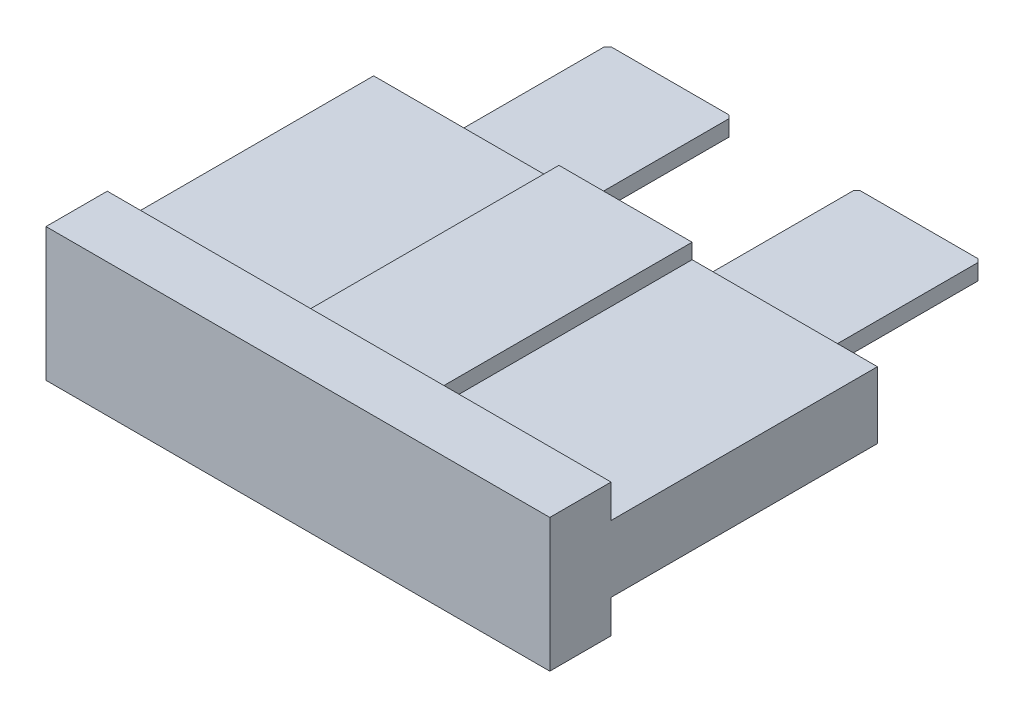
ISO-10303-21;
HEADER;
FILE_DESCRIPTION(('STEP AP214'),'2;1');
FILE_NAME('part.step','',(''),(''),'','','');
FILE_SCHEMA(('AUTOMOTIVE_DESIGN { 1 0 10303 214 1 1 1 1 }'));
ENDSEC;
DATA;
#1=APPLICATION_CONTEXT('core data for automotive mechanical design processes');
#2=APPLICATION_PROTOCOL_DEFINITION('international standard','automotive_design',2000,#1);
#3=PRODUCT_CONTEXT('',#1,'mechanical');
#4=PRODUCT('Part','Part','',(#3));
#5=PRODUCT_RELATED_PRODUCT_CATEGORY('part','',(#4));
#6=PRODUCT_DEFINITION_FORMATION('','',#4);
#7=PRODUCT_DEFINITION_CONTEXT('part definition',#1,'design');
#8=PRODUCT_DEFINITION('design','',#6,#7);
#9=PRODUCT_DEFINITION_SHAPE('','',#8);
#10=(LENGTH_UNIT() NAMED_UNIT(*) SI_UNIT(.MILLI.,.METRE.));
#11=(NAMED_UNIT(*) PLANE_ANGLE_UNIT() SI_UNIT($,.RADIAN.));
#12=(NAMED_UNIT(*) SI_UNIT($,.STERADIAN.) SOLID_ANGLE_UNIT());
#13=UNCERTAINTY_MEASURE_WITH_UNIT(LENGTH_MEASURE(1.E-05),#10,'distance_accuracy_value','');
#14=(GEOMETRIC_REPRESENTATION_CONTEXT(3) GLOBAL_UNCERTAINTY_ASSIGNED_CONTEXT((#13)) GLOBAL_UNIT_ASSIGNED_CONTEXT((#10,
#11,#12)) REPRESENTATION_CONTEXT('',''));
#15=CARTESIAN_POINT('',(0.,0.,0.));
#16=DIRECTION('',(0.,0.,1.));
#17=DIRECTION('',(1.,0.,0.));
#18=AXIS2_PLACEMENT_3D('',#15,#16,#17);
#19=CARTESIAN_POINT('',(-52.0016807572496,11.3994658131918,-16.7386));
#20=DIRECTION('',(0.,0.,1.));
#21=DIRECTION('',(1.,0.,0.));
#22=AXIS2_PLACEMENT_3D('',#19,#20,#21);
#23=PLANE('',#22);
#24=DIRECTION('',(0.,1.,0.));
#25=VECTOR('',#24,1.);
#26=CARTESIAN_POINT('',(-54.1225807572496,11.3994658131918,-16.7386));
#27=LINE('',#26,#25);
#28=CARTESIAN_POINT('',(-54.1225807572496,11.5772658131918,-16.7386));
#29=VERTEX_POINT('',#28);
#30=CARTESIAN_POINT('',(-54.1225807572496,11.2216658131918,-16.7386));
#31=VERTEX_POINT('',#30);
#32=EDGE_CURVE('E225',#29,#31,#27,.F.);
#33=ORIENTED_EDGE('',*,*,#32,.F.);
#34=DIRECTION('',(1.,0.,0.));
#35=VECTOR('',#34,1.);
#36=CARTESIAN_POINT('',(-50.8142307572496,11.5772658131918,-16.7386));
#37=LINE('',#36,#35);
#38=CARTESIAN_POINT('',(-49.8807807572496,11.5772658131918,-16.7386));
#39=VERTEX_POINT('',#38);
#40=EDGE_CURVE('E242',#39,#29,#37,.F.);
#41=ORIENTED_EDGE('',*,*,#40,.F.);
#42=DIRECTION('',(0.,1.,0.));
#43=VECTOR('',#42,1.);
#44=CARTESIAN_POINT('',(-49.8807807572496,11.3994658131918,-16.7386));
#45=LINE('',#44,#43);
#46=CARTESIAN_POINT('',(-49.8807807572496,11.2216658131918,-16.7386));
#47=VERTEX_POINT('',#46);
#48=EDGE_CURVE('E20',#47,#39,#45,.T.);
#49=ORIENTED_EDGE('',*,*,#48,.F.);
#50=DIRECTION('',(1.,0.,0.));
#51=VECTOR('',#50,1.);
#52=CARTESIAN_POINT('',(-53.1891307572496,11.2216658131918,-16.7386));
#53=LINE('',#52,#51);
#54=EDGE_CURVE('E239',#31,#47,#53,.T.);
#55=ORIENTED_EDGE('',*,*,#54,.F.);
#56=EDGE_LOOP('',(#33,#41,#49,#55));
#57=FACE_BOUND('',#56,.T.);
#58=ADVANCED_FACE('F17',(#57),#23,.F.);
#59=CARTESIAN_POINT('',(-61.5016807572496,11.3994658131918,-16.7386));
#60=DIRECTION('',(0.,0.,1.));
#61=DIRECTION('',(1.,0.,0.));
#62=AXIS2_PLACEMENT_3D('',#59,#60,#61);
#63=PLANE('',#62);
#64=DIRECTION('',(0.,1.,0.));
#65=VECTOR('',#64,1.);
#66=CARTESIAN_POINT('',(-59.3807807572496,11.3994658131918,-16.7386));
#67=LINE('',#66,#65);
#68=CARTESIAN_POINT('',(-59.3807807572496,11.2216658131918,-16.7386));
#69=VERTEX_POINT('',#68);
#70=CARTESIAN_POINT('',(-59.3807807572496,11.5772658131918,-16.7386));
#71=VERTEX_POINT('',#70);
#72=EDGE_CURVE('E243',#69,#71,#67,.T.);
#73=ORIENTED_EDGE('',*,*,#72,.F.);
#74=DIRECTION('',(1.,0.,0.));
#75=VECTOR('',#74,1.);
#76=CARTESIAN_POINT('',(-62.6891307572496,11.2216658131918,-16.7386));
#77=LINE('',#76,#75);
#78=CARTESIAN_POINT('',(-63.6225807572496,11.2216658131918,-16.7386));
#79=VERTEX_POINT('',#78);
#80=EDGE_CURVE('E270',#79,#69,#77,.T.);
#81=ORIENTED_EDGE('',*,*,#80,.F.);
#82=DIRECTION('',(0.,1.,0.));
#83=VECTOR('',#82,1.);
#84=CARTESIAN_POINT('',(-63.6225807572496,11.3994658131918,-16.7386));
#85=LINE('',#84,#83);
#86=CARTESIAN_POINT('',(-63.6225807572496,11.5772658131918,-16.7386));
#87=VERTEX_POINT('',#86);
#88=EDGE_CURVE('E237',#87,#79,#85,.F.);
#89=ORIENTED_EDGE('',*,*,#88,.F.);
#90=DIRECTION('',(1.,0.,0.));
#91=VECTOR('',#90,1.);
#92=CARTESIAN_POINT('',(-60.3142307572496,11.5772658131918,-16.7386));
#93=LINE('',#92,#91);
#94=EDGE_CURVE('E274',#71,#87,#93,.F.);
#95=ORIENTED_EDGE('',*,*,#94,.F.);
#96=EDGE_LOOP('',(#73,#81,#89,#95));
#97=FACE_BOUND('',#96,.T.);
#98=ADVANCED_FACE('F271',(#97),#63,.F.);
#99=CARTESIAN_POINT('',(-53.1891307572496,11.1581658131918,-16.6751));
#100=DIRECTION('',(0.,-0.707106781186548,-0.707106781186548));
#101=DIRECTION('',(0.,0.707106781186548,-0.707106781186548));
#102=AXIS2_PLACEMENT_3D('',#99,#100,#101);
#103=PLANE('',#102);
#104=DIRECTION('',(-0.577350269189631,-0.577350269189615,0.577350269189631));
#105=VECTOR('',#104,1.);
#106=CARTESIAN_POINT('',(-54.1225807572496,11.2216658131918,-16.7386));
#107=LINE('',#106,#105);
#108=CARTESIAN_POINT('',(-54.2495807572496,11.0946658131918,-16.6116));
#109=VERTEX_POINT('',#108);
#110=EDGE_CURVE('E233',#31,#109,#107,.T.);
#111=ORIENTED_EDGE('',*,*,#110,.F.);
#112=ORIENTED_EDGE('',*,*,#54,.T.);
#113=DIRECTION('',(-0.577350269189631,0.577350269189615,-0.577350269189631));
#114=VECTOR('',#113,1.);
#115=CARTESIAN_POINT('',(-49.7537807572496,11.0946658131918,-16.6116));
#116=LINE('',#115,#114);
#117=CARTESIAN_POINT('',(-49.7537807572496,11.0946658131918,-16.6116));
#118=VERTEX_POINT('',#117);
#119=EDGE_CURVE('E292',#118,#47,#116,.T.);
#120=ORIENTED_EDGE('',*,*,#119,.F.);
#121=DIRECTION('',(1.,0.,0.));
#122=VECTOR('',#121,1.);
#123=CARTESIAN_POINT('',(-54.3765807572496,11.0946658131918,-16.6116));
#124=LINE('',#123,#122);
#125=EDGE_CURVE('E247',#109,#118,#124,.T.);
#126=ORIENTED_EDGE('',*,*,#125,.F.);
#127=EDGE_LOOP('',(#111,#112,#120,#126));
#128=FACE_BOUND('',#127,.T.);
#129=ADVANCED_FACE('F245',(#128),#103,.T.);
#130=CARTESIAN_POINT('',(-50.8142307572496,11.6407658131918,-16.6751));
#131=DIRECTION('',(0.,0.707106781186548,-0.707106781186548));
#132=DIRECTION('',(0.,0.707106781186548,0.707106781186548));
#133=AXIS2_PLACEMENT_3D('',#130,#131,#132);
#134=PLANE('',#133);
#135=DIRECTION('',(0.577350269189628,0.577350269189621,0.577350269189628));
#136=VECTOR('',#135,1.);
#137=CARTESIAN_POINT('',(-49.8807807572496,11.5772658131918,-16.7386));
#138=LINE('',#137,#136);
#139=CARTESIAN_POINT('',(-49.7537807572496,11.7042658131918,-16.6116));
#140=VERTEX_POINT('',#139);
#141=EDGE_CURVE('E289',#39,#140,#138,.T.);
#142=ORIENTED_EDGE('',*,*,#141,.F.);
#143=ORIENTED_EDGE('',*,*,#40,.T.);
#144=DIRECTION('',(0.577350269189628,-0.577350269189621,-0.577350269189628));
#145=VECTOR('',#144,1.);
#146=CARTESIAN_POINT('',(-54.2495807572496,11.7042658131918,-16.6116));
#147=LINE('',#146,#145);
#148=CARTESIAN_POINT('',(-54.2495807572496,11.7042658131918,-16.6116));
#149=VERTEX_POINT('',#148);
#150=EDGE_CURVE('E236',#149,#29,#147,.T.);
#151=ORIENTED_EDGE('',*,*,#150,.F.);
#152=DIRECTION('',(1.,0.,0.));
#153=VECTOR('',#152,1.);
#154=CARTESIAN_POINT('',(-49.6267807572496,11.7042658131918,-16.6116));
#155=LINE('',#154,#153);
#156=EDGE_CURVE('E309',#140,#149,#155,.F.);
#157=ORIENTED_EDGE('',*,*,#156,.F.);
#158=EDGE_LOOP('',(#142,#143,#151,#157));
#159=FACE_BOUND('',#158,.T.);
#160=ADVANCED_FACE('F458',(#159),#134,.T.);
#161=CARTESIAN_POINT('',(-54.2495807572496,11.5518658131918,-16.6116));
#162=DIRECTION('',(-0.707106781186544,0.,-0.707106781186551));
#163=DIRECTION('',(-0.707106781186551,0.,0.707106781186544));
#164=AXIS2_PLACEMENT_3D('',#161,#162,#163);
#165=PLANE('',#164);
#166=ORIENTED_EDGE('',*,*,#150,.T.);
#167=ORIENTED_EDGE('',*,*,#32,.T.);
#168=ORIENTED_EDGE('',*,*,#110,.T.);
#169=DIRECTION('',(0.707106781186528,0.,-0.707106781186567));
#170=VECTOR('',#169,1.);
#171=CARTESIAN_POINT('',(-54.3765807572496,11.0946658131918,-16.4846));
#172=LINE('',#171,#170);
#173=CARTESIAN_POINT('',(-54.3765807572496,11.0946658131918,-16.4846));
#174=VERTEX_POINT('',#173);
#175=EDGE_CURVE('E307',#174,#109,#172,.T.);
#176=ORIENTED_EDGE('',*,*,#175,.F.);
#177=DIRECTION('',(0.,1.,0.));
#178=VECTOR('',#177,1.);
#179=CARTESIAN_POINT('',(-54.3765807572496,11.7042658131918,-16.4846));
#180=LINE('',#179,#178);
#181=CARTESIAN_POINT('',(-54.3765807572496,11.7042658131918,-16.4846));
#182=VERTEX_POINT('',#181);
#183=EDGE_CURVE('E249',#182,#174,#180,.F.);
#184=ORIENTED_EDGE('',*,*,#183,.F.);
#185=DIRECTION('',(-0.707106781186547,0.,0.707106781186547));
#186=VECTOR('',#185,1.);
#187=CARTESIAN_POINT('',(-54.2495807572496,11.7042658131918,-16.6116));
#188=LINE('',#187,#186);
#189=EDGE_CURVE('E451',#149,#182,#188,.T.);
#190=ORIENTED_EDGE('',*,*,#189,.F.);
#191=EDGE_LOOP('',(#166,#167,#168,#176,#184,#190));
#192=FACE_BOUND('',#191,.T.);
#193=ADVANCED_FACE('F230',(#192),#165,.T.);
#194=CARTESIAN_POINT('',(-54.3765807572496,11.7042658131918,-10.16));
#195=DIRECTION('',(-1.,0.,0.));
#196=DIRECTION('',(0.,0.,1.));
#197=AXIS2_PLACEMENT_3D('',#194,#195,#196);
#198=PLANE('',#197);
#199=DIRECTION('',(0.,1.,0.));
#200=VECTOR('',#199,1.);
#201=CARTESIAN_POINT('',(-54.3765807572496,11.7042658131918,-10.16));
#202=LINE('',#201,#200);
#203=CARTESIAN_POINT('',(-54.3765807572496,11.0946658131918,-10.16));
#204=VERTEX_POINT('',#203);
#205=CARTESIAN_POINT('',(-54.3765807572496,11.7042658131918,-10.16));
#206=VERTEX_POINT('',#205);
#207=EDGE_CURVE('E296',#204,#206,#202,.T.);
#208=ORIENTED_EDGE('',*,*,#207,.T.);
#209=DIRECTION('',(0.,0.,1.));
#210=VECTOR('',#209,1.);
#211=CARTESIAN_POINT('',(-54.3765807572496,11.7042658131918,-10.16));
#212=LINE('',#211,#210);
#213=EDGE_CURVE('E305',#182,#206,#212,.T.);
#214=ORIENTED_EDGE('',*,*,#213,.F.);
#215=ORIENTED_EDGE('',*,*,#183,.T.);
#216=DIRECTION('',(0.,0.,-1.));
#217=VECTOR('',#216,1.);
#218=CARTESIAN_POINT('',(-54.3765807572496,11.0946658131918,-10.16));
#219=LINE('',#218,#217);
#220=EDGE_CURVE('E302',#204,#174,#219,.T.);
#221=ORIENTED_EDGE('',*,*,#220,.F.);
#222=EDGE_LOOP('',(#208,#214,#215,#221));
#223=FACE_BOUND('',#222,.T.);
#224=ADVANCED_FACE('F300',(#223),#198,.T.);
#225=CARTESIAN_POINT('',(-49.6267807572496,11.0946658131918,-10.16));
#226=DIRECTION('',(1.,0.,0.));
#227=DIRECTION('',(0.,0.,-1.));
#228=AXIS2_PLACEMENT_3D('',#225,#226,#227);
#229=PLANE('',#228);
#230=DIRECTION('',(0.,1.,0.));
#231=VECTOR('',#230,1.);
#232=CARTESIAN_POINT('',(-49.6267807572496,11.0946658131918,-10.16));
#233=LINE('',#232,#231);
#234=CARTESIAN_POINT('',(-49.6267807572496,11.7042658131918,-10.16));
#235=VERTEX_POINT('',#234);
#236=CARTESIAN_POINT('',(-49.6267807572496,11.0946658131918,-10.16));
#237=VERTEX_POINT('',#236);
#238=EDGE_CURVE('E294',#235,#237,#233,.F.);
#239=ORIENTED_EDGE('',*,*,#238,.T.);
#240=DIRECTION('',(0.,0.,-1.));
#241=VECTOR('',#240,1.);
#242=CARTESIAN_POINT('',(-49.6267807572496,11.0946658131918,-10.16));
#243=LINE('',#242,#241);
#244=CARTESIAN_POINT('',(-49.6267807572496,11.0946658131918,-16.4846));
#245=VERTEX_POINT('',#244);
#246=EDGE_CURVE('E315',#245,#237,#243,.F.);
#247=ORIENTED_EDGE('',*,*,#246,.F.);
#248=DIRECTION('',(0.,1.,0.));
#249=VECTOR('',#248,1.);
#250=CARTESIAN_POINT('',(-49.6267807572496,11.2470658131918,-16.4846));
#251=LINE('',#250,#249);
#252=CARTESIAN_POINT('',(-49.6267807572496,11.7042658131918,-16.4846));
#253=VERTEX_POINT('',#252);
#254=EDGE_CURVE('E275',#253,#245,#251,.F.);
#255=ORIENTED_EDGE('',*,*,#254,.F.);
#256=DIRECTION('',(0.,0.,1.));
#257=VECTOR('',#256,1.);
#258=CARTESIAN_POINT('',(-49.6267807572496,11.7042658131918,-10.16));
#259=LINE('',#258,#257);
#260=EDGE_CURVE('E447',#235,#253,#259,.F.);
#261=ORIENTED_EDGE('',*,*,#260,.F.);
#262=EDGE_LOOP('',(#239,#247,#255,#261));
#263=FACE_BOUND('',#262,.T.);
#264=ADVANCED_FACE('F467',(#263),#229,.T.);
#265=CARTESIAN_POINT('',(-49.7537807572496,11.2470658131918,-16.6116));
#266=DIRECTION('',(0.707106781186544,0.,-0.707106781186551));
#267=DIRECTION('',(-0.707106781186551,0.,-0.707106781186544));
#268=AXIS2_PLACEMENT_3D('',#265,#266,#267);
#269=PLANE('',#268);
#270=ORIENTED_EDGE('',*,*,#254,.T.);
#271=DIRECTION('',(0.707106781186547,0.,0.707106781186547));
#272=VECTOR('',#271,1.);
#273=CARTESIAN_POINT('',(-49.7537807572496,11.0946658131918,-16.6116));
#274=LINE('',#273,#272);
#275=EDGE_CURVE('E317',#118,#245,#274,.T.);
#276=ORIENTED_EDGE('',*,*,#275,.F.);
#277=ORIENTED_EDGE('',*,*,#119,.T.);
#278=ORIENTED_EDGE('',*,*,#48,.T.);
#279=ORIENTED_EDGE('',*,*,#141,.T.);
#280=DIRECTION('',(-0.707106781186547,0.,-0.707106781186547));
#281=VECTOR('',#280,1.);
#282=CARTESIAN_POINT('',(-49.6267807572496,11.7042658131918,-16.4846));
#283=LINE('',#282,#281);
#284=EDGE_CURVE('E444',#253,#140,#283,.T.);
#285=ORIENTED_EDGE('',*,*,#284,.F.);
#286=EDGE_LOOP('',(#270,#276,#277,#278,#279,#285));
#287=FACE_BOUND('',#286,.T.);
#288=ADVANCED_FACE('F460',(#287),#269,.T.);
#289=CARTESIAN_POINT('',(-62.6891307572496,11.1581658131918,-16.6751));
#290=DIRECTION('',(0.,-0.707106781186548,-0.707106781186548));
#291=DIRECTION('',(0.,0.707106781186548,-0.707106781186548));
#292=AXIS2_PLACEMENT_3D('',#289,#290,#291);
#293=PLANE('',#292);
#294=DIRECTION('',(-0.577350269189663,-0.577350269189584,0.577350269189631));
#295=VECTOR('',#294,1.);
#296=CARTESIAN_POINT('',(-63.6225807572496,11.2216658131918,-16.7386));
#297=LINE('',#296,#295);
#298=CARTESIAN_POINT('',(-63.7495807572496,11.0946658131918,-16.6116));
#299=VERTEX_POINT('',#298);
#300=EDGE_CURVE('E262',#79,#299,#297,.T.);
#301=ORIENTED_EDGE('',*,*,#300,.F.);
#302=ORIENTED_EDGE('',*,*,#80,.T.);
#303=DIRECTION('',(-0.577350269189621,0.577350269189636,-0.577350269189621));
#304=VECTOR('',#303,1.);
#305=CARTESIAN_POINT('',(-59.2537807572496,11.0946658131918,-16.6116));
#306=LINE('',#305,#304);
#307=CARTESIAN_POINT('',(-59.2537807572496,11.0946658131918,-16.6116));
#308=VERTEX_POINT('',#307);
#309=EDGE_CURVE('E339',#308,#69,#306,.T.);
#310=ORIENTED_EDGE('',*,*,#309,.F.);
#311=DIRECTION('',(1.,0.,0.));
#312=VECTOR('',#311,1.);
#313=CARTESIAN_POINT('',(-63.8765807572496,11.0946658131918,-16.6116));
#314=LINE('',#313,#312);
#315=EDGE_CURVE('E279',#299,#308,#314,.T.);
#316=ORIENTED_EDGE('',*,*,#315,.F.);
#317=EDGE_LOOP('',(#301,#302,#310,#316));
#318=FACE_BOUND('',#317,.T.);
#319=ADVANCED_FACE('F277',(#318),#293,.T.);
#320=CARTESIAN_POINT('',(-60.3142307572496,11.6407658131918,-16.6751));
#321=DIRECTION('',(0.,0.707106781186548,-0.707106781186548));
#322=DIRECTION('',(0.,0.707106781186548,0.707106781186548));
#323=AXIS2_PLACEMENT_3D('',#320,#321,#322);
#324=PLANE('',#323);
#325=DIRECTION('',(0.577350269189613,0.577350269189636,0.577350269189628));
#326=VECTOR('',#325,1.);
#327=CARTESIAN_POINT('',(-59.3807807572496,11.5772658131918,-16.7386));
#328=LINE('',#327,#326);
#329=CARTESIAN_POINT('',(-59.2537807572496,11.7042658131918,-16.6116));
#330=VERTEX_POINT('',#329);
#331=EDGE_CURVE('E343',#71,#330,#328,.T.);
#332=ORIENTED_EDGE('',*,*,#331,.F.);
#333=ORIENTED_EDGE('',*,*,#94,.T.);
#334=DIRECTION('',(0.57735026918966,-0.577350269189589,-0.577350269189628));
#335=VECTOR('',#334,1.);
#336=CARTESIAN_POINT('',(-63.7495807572496,11.7042658131918,-16.6116));
#337=LINE('',#336,#335);
#338=CARTESIAN_POINT('',(-63.7495807572496,11.7042658131918,-16.6116));
#339=VERTEX_POINT('',#338);
#340=EDGE_CURVE('E265',#339,#87,#337,.T.);
#341=ORIENTED_EDGE('',*,*,#340,.F.);
#342=DIRECTION('',(1.,0.,0.));
#343=VECTOR('',#342,1.);
#344=CARTESIAN_POINT('',(-59.1267807572496,11.7042658131918,-16.6116));
#345=LINE('',#344,#343);
#346=EDGE_CURVE('E432',#330,#339,#345,.F.);
#347=ORIENTED_EDGE('',*,*,#346,.F.);
#348=EDGE_LOOP('',(#332,#333,#341,#347));
#349=FACE_BOUND('',#348,.T.);
#350=ADVANCED_FACE('F572',(#349),#324,.T.);
#351=CARTESIAN_POINT('',(-63.7495807572496,11.5518658131918,-16.6116));
#352=DIRECTION('',(-0.707106781186532,0.,-0.707106781186563));
#353=DIRECTION('',(-0.707106781186563,0.,0.707106781186532));
#354=AXIS2_PLACEMENT_3D('',#351,#352,#353);
#355=PLANE('',#354);
#356=DIRECTION('',(0.,1.,0.));
#357=VECTOR('',#356,1.);
#358=CARTESIAN_POINT('',(-63.8765807572496,11.7042658131918,-16.4846));
#359=LINE('',#358,#357);
#360=CARTESIAN_POINT('',(-63.8765807572496,11.7042658131918,-16.4846));
#361=VERTEX_POINT('',#360);
#362=CARTESIAN_POINT('',(-63.8765807572496,11.0946658131918,-16.4846));
#363=VERTEX_POINT('',#362);
#364=EDGE_CURVE('E280',#361,#363,#359,.F.);
#365=ORIENTED_EDGE('',*,*,#364,.F.);
#366=DIRECTION('',(-0.707106781186547,0.,0.707106781186547));
#367=VECTOR('',#366,1.);
#368=CARTESIAN_POINT('',(-63.7495807572496,11.7042658131918,-16.6116));
#369=LINE('',#368,#367);
#370=EDGE_CURVE('E366',#339,#361,#369,.T.);
#371=ORIENTED_EDGE('',*,*,#370,.F.);
#372=ORIENTED_EDGE('',*,*,#340,.T.);
#373=ORIENTED_EDGE('',*,*,#88,.T.);
#374=ORIENTED_EDGE('',*,*,#300,.T.);
#375=DIRECTION('',(0.707106781186509,0.,-0.707106781186586));
#376=VECTOR('',#375,1.);
#377=CARTESIAN_POINT('',(-63.8765807572496,11.0946658131918,-16.4846));
#378=LINE('',#377,#376);
#379=EDGE_CURVE('E434',#363,#299,#378,.T.);
#380=ORIENTED_EDGE('',*,*,#379,.F.);
#381=EDGE_LOOP('',(#365,#371,#372,#373,#374,#380));
#382=FACE_BOUND('',#381,.T.);
#383=ADVANCED_FACE('F259',(#382),#355,.T.);
#384=CARTESIAN_POINT('',(-63.8765807572496,11.7042658131918,-10.16));
#385=DIRECTION('',(-1.,0.,0.));
#386=DIRECTION('',(0.,0.,1.));
#387=AXIS2_PLACEMENT_3D('',#384,#385,#386);
#388=PLANE('',#387);
#389=DIRECTION('',(0.,1.,0.));
#390=VECTOR('',#389,1.);
#391=CARTESIAN_POINT('',(-63.8765807572496,11.7042658131918,-10.16));
#392=LINE('',#391,#390);
#393=CARTESIAN_POINT('',(-63.8765807572496,11.0946658131918,-10.16));
#394=VERTEX_POINT('',#393);
#395=CARTESIAN_POINT('',(-63.8765807572496,11.7042658131918,-10.16));
#396=VERTEX_POINT('',#395);
#397=EDGE_CURVE('E282',#394,#396,#392,.T.);
#398=ORIENTED_EDGE('',*,*,#397,.T.);
#399=DIRECTION('',(0.,0.,1.));
#400=VECTOR('',#399,1.);
#401=CARTESIAN_POINT('',(-63.8765807572496,11.7042658131918,-10.16));
#402=LINE('',#401,#400);
#403=EDGE_CURVE('E352',#361,#396,#402,.T.);
#404=ORIENTED_EDGE('',*,*,#403,.F.);
#405=ORIENTED_EDGE('',*,*,#364,.T.);
#406=DIRECTION('',(0.,0.,-1.));
#407=VECTOR('',#406,1.);
#408=CARTESIAN_POINT('',(-63.8765807572496,11.0946658131918,-10.16));
#409=LINE('',#408,#407);
#410=EDGE_CURVE('E355',#394,#363,#409,.T.);
#411=ORIENTED_EDGE('',*,*,#410,.F.);
#412=EDGE_LOOP('',(#398,#404,#405,#411));
#413=FACE_BOUND('',#412,.T.);
#414=ADVANCED_FACE('F351',(#413),#388,.T.);
#415=CARTESIAN_POINT('',(-59.1267807572496,11.0946658131918,-10.16));
#416=DIRECTION('',(1.,0.,0.));
#417=DIRECTION('',(0.,0.,-1.));
#418=AXIS2_PLACEMENT_3D('',#415,#416,#417);
#419=PLANE('',#418);
#420=DIRECTION('',(0.,1.,0.));
#421=VECTOR('',#420,1.);
#422=CARTESIAN_POINT('',(-59.1267807572496,11.0946658131918,-10.16));
#423=LINE('',#422,#421);
#424=CARTESIAN_POINT('',(-59.1267807572496,11.7042658131918,-10.16));
#425=VERTEX_POINT('',#424);
#426=CARTESIAN_POINT('',(-59.1267807572496,11.0946658131918,-10.16));
#427=VERTEX_POINT('',#426);
#428=EDGE_CURVE('E346',#425,#427,#423,.F.);
#429=ORIENTED_EDGE('',*,*,#428,.T.);
#430=DIRECTION('',(0.,0.,-1.));
#431=VECTOR('',#430,1.);
#432=CARTESIAN_POINT('',(-59.1267807572496,11.0946658131918,-10.16));
#433=LINE('',#432,#431);
#434=CARTESIAN_POINT('',(-59.1267807572496,11.0946658131918,-16.4846));
#435=VERTEX_POINT('',#434);
#436=EDGE_CURVE('E437',#435,#427,#433,.F.);
#437=ORIENTED_EDGE('',*,*,#436,.F.);
#438=DIRECTION('',(0.,1.,0.));
#439=VECTOR('',#438,1.);
#440=CARTESIAN_POINT('',(-59.1267807572496,11.2470658131918,-16.4846));
#441=LINE('',#440,#439);
#442=CARTESIAN_POINT('',(-59.1267807572496,11.7042658131918,-16.4846));
#443=VERTEX_POINT('',#442);
#444=EDGE_CURVE('E341',#443,#435,#441,.F.);
#445=ORIENTED_EDGE('',*,*,#444,.F.);
#446=DIRECTION('',(0.,0.,1.));
#447=VECTOR('',#446,1.);
#448=CARTESIAN_POINT('',(-59.1267807572496,11.7042658131918,-10.16));
#449=LINE('',#448,#447);
#450=EDGE_CURVE('E367',#425,#443,#449,.F.);
#451=ORIENTED_EDGE('',*,*,#450,.F.);
#452=EDGE_LOOP('',(#429,#437,#445,#451));
#453=FACE_BOUND('',#452,.T.);
#454=ADVANCED_FACE('F563',(#453),#419,.T.);
#455=CARTESIAN_POINT('',(-59.2537807572496,11.2470658131918,-16.6116));
#456=DIRECTION('',(0.707106781186557,0.,-0.707106781186538));
#457=DIRECTION('',(-0.707106781186538,0.,-0.707106781186557));
#458=AXIS2_PLACEMENT_3D('',#455,#456,#457);
#459=PLANE('',#458);
#460=ORIENTED_EDGE('',*,*,#309,.T.);
#461=ORIENTED_EDGE('',*,*,#72,.T.);
#462=ORIENTED_EDGE('',*,*,#331,.T.);
#463=DIRECTION('',(-0.707106781186528,0.,-0.707106781186567));
#464=VECTOR('',#463,1.);
#465=CARTESIAN_POINT('',(-59.1267807572496,11.7042658131918,-16.4846));
#466=LINE('',#465,#464);
#467=EDGE_CURVE('E427',#443,#330,#466,.T.);
#468=ORIENTED_EDGE('',*,*,#467,.F.);
#469=ORIENTED_EDGE('',*,*,#444,.T.);
#470=DIRECTION('',(0.707106781186528,0.,0.707106781186567));
#471=VECTOR('',#470,1.);
#472=CARTESIAN_POINT('',(-59.2537807572496,11.0946658131918,-16.6116));
#473=LINE('',#472,#471);
#474=EDGE_CURVE('E440',#308,#435,#473,.T.);
#475=ORIENTED_EDGE('',*,*,#474,.F.);
#476=EDGE_LOOP('',(#460,#461,#462,#468,#469,#475));
#477=FACE_BOUND('',#476,.T.);
#478=ADVANCED_FACE('F559',(#477),#459,.T.);
#479=CARTESIAN_POINT('',(-54.2055307572496,11.3994658131918,-5.08));
#480=DIRECTION('',(-1.,0.,0.));
#481=DIRECTION('',(0.,0.,1.));
#482=AXIS2_PLACEMENT_3D('',#479,#480,#481);
#483=PLANE('',#482);
#484=DIRECTION('',(0.,1.,0.));
#485=VECTOR('',#484,1.);
#486=CARTESIAN_POINT('',(-54.2055307572496,11.3994658131918,-10.16));
#487=LINE('',#486,#485);
#488=CARTESIAN_POINT('',(-54.2055307572496,13.2473158131918,-10.16));
#489=VERTEX_POINT('',#488);
#490=CARTESIAN_POINT('',(-54.2055307572496,12.6694658131918,-10.16));
#491=VERTEX_POINT('',#490);
#492=EDGE_CURVE('E335',#489,#491,#487,.F.);
#493=ORIENTED_EDGE('',*,*,#492,.F.);
#494=DIRECTION('',(0.,0.,-1.));
#495=VECTOR('',#494,1.);
#496=CARTESIAN_POINT('',(-54.2055307572496,13.2473158131918,-5.08));
#497=LINE('',#496,#495);
#498=CARTESIAN_POINT('',(-54.2055307572496,13.2473158131918,0.));
#499=VERTEX_POINT('',#498);
#500=EDGE_CURVE('E324',#489,#499,#497,.F.);
#501=ORIENTED_EDGE('',*,*,#500,.T.);
#502=DIRECTION('',(0.,1.,0.));
#503=VECTOR('',#502,1.);
#504=CARTESIAN_POINT('',(-54.2055307572496,11.3994658131918,0.));
#505=LINE('',#504,#503);
#506=CARTESIAN_POINT('',(-54.2055307572496,12.6694658131918,0.));
#507=VERTEX_POINT('',#506);
#508=EDGE_CURVE('E337',#507,#499,#505,.T.);
#509=ORIENTED_EDGE('',*,*,#508,.F.);
#510=DIRECTION('',(0.,0.,-1.));
#511=VECTOR('',#510,1.);
#512=CARTESIAN_POINT('',(-54.2055307572496,12.6694658131918,-5.08));
#513=LINE('',#512,#511);
#514=EDGE_CURVE('E416',#507,#491,#513,.T.);
#515=ORIENTED_EDGE('',*,*,#514,.T.);
#516=EDGE_LOOP('',(#493,#501,#509,#515));
#517=FACE_BOUND('',#516,.T.);
#518=ADVANCED_FACE('F555',(#517),#483,.F.);
#519=CARTESIAN_POINT('',(-54.2055307572496,11.3994658131918,-5.08));
#520=DIRECTION('',(-1.,0.,0.));
#521=DIRECTION('',(0.,0.,1.));
#522=AXIS2_PLACEMENT_3D('',#519,#520,#521);
#523=PLANE('',#522);
#524=DIRECTION('',(0.,1.,0.));
#525=VECTOR('',#524,1.);
#526=CARTESIAN_POINT('',(-54.2055307572496,11.3994658131918,0.));
#527=LINE('',#526,#525);
#528=CARTESIAN_POINT('',(-54.2055307572496,9.55161581319177,0.));
#529=VERTEX_POINT('',#528);
#530=CARTESIAN_POINT('',(-54.2055307572496,10.1294658131918,0.));
#531=VERTEX_POINT('',#530);
#532=EDGE_CURVE('E331',#529,#531,#527,.T.);
#533=ORIENTED_EDGE('',*,*,#532,.F.);
#534=DIRECTION('',(0.,0.,1.));
#535=VECTOR('',#534,1.);
#536=CARTESIAN_POINT('',(-54.2055307572496,9.55161581319177,-5.08));
#537=LINE('',#536,#535);
#538=CARTESIAN_POINT('',(-54.2055307572496,9.55161581319177,-10.16));
#539=VERTEX_POINT('',#538);
#540=EDGE_CURVE('E422',#529,#539,#537,.F.);
#541=ORIENTED_EDGE('',*,*,#540,.T.);
#542=DIRECTION('',(0.,1.,0.));
#543=VECTOR('',#542,1.);
#544=CARTESIAN_POINT('',(-54.2055307572496,11.3994658131918,-10.16));
#545=LINE('',#544,#543);
#546=CARTESIAN_POINT('',(-54.2055307572496,10.1294658131918,-10.16));
#547=VERTEX_POINT('',#546);
#548=EDGE_CURVE('E333',#547,#539,#545,.F.);
#549=ORIENTED_EDGE('',*,*,#548,.F.);
#550=DIRECTION('',(0.,0.,1.));
#551=VECTOR('',#550,1.);
#552=CARTESIAN_POINT('',(-54.2055307572496,10.1294658131918,-5.08));
#553=LINE('',#552,#551);
#554=EDGE_CURVE('E413',#547,#531,#553,.T.);
#555=ORIENTED_EDGE('',*,*,#554,.T.);
#556=EDGE_LOOP('',(#533,#541,#549,#555));
#557=FACE_BOUND('',#556,.T.);
#558=ADVANCED_FACE('F551',(#557),#523,.F.);
#559=CARTESIAN_POINT('',(-59.2855307572496,11.3994658131918,-5.08));
#560=DIRECTION('',(1.,0.,0.));
#561=DIRECTION('',(0.,0.,-1.));
#562=AXIS2_PLACEMENT_3D('',#559,#560,#561);
#563=PLANE('',#562);
#564=DIRECTION('',(0.,1.,0.));
#565=VECTOR('',#564,1.);
#566=CARTESIAN_POINT('',(-59.2855307572496,11.3994658131918,-10.16));
#567=LINE('',#566,#565);
#568=CARTESIAN_POINT('',(-59.2855307572496,9.55161581319177,-10.16));
#569=VERTEX_POINT('',#568);
#570=CARTESIAN_POINT('',(-59.2855307572496,10.1294658131918,-10.16));
#571=VERTEX_POINT('',#570);
#572=EDGE_CURVE('E327',#569,#571,#567,.T.);
#573=ORIENTED_EDGE('',*,*,#572,.F.);
#574=DIRECTION('',(0.,0.,1.));
#575=VECTOR('',#574,1.);
#576=CARTESIAN_POINT('',(-59.2855307572496,9.55161581319177,-5.08));
#577=LINE('',#576,#575);
#578=CARTESIAN_POINT('',(-59.2855307572496,9.55161581319177,0.));
#579=VERTEX_POINT('',#578);
#580=EDGE_CURVE('E419',#569,#579,#577,.T.);
#581=ORIENTED_EDGE('',*,*,#580,.T.);
#582=DIRECTION('',(0.,1.,0.));
#583=VECTOR('',#582,1.);
#584=CARTESIAN_POINT('',(-59.2855307572496,11.3994658131918,0.));
#585=LINE('',#584,#583);
#586=CARTESIAN_POINT('',(-59.2855307572496,10.1294658131918,0.));
#587=VERTEX_POINT('',#586);
#588=EDGE_CURVE('E329',#587,#579,#585,.F.);
#589=ORIENTED_EDGE('',*,*,#588,.F.);
#590=DIRECTION('',(0.,0.,1.));
#591=VECTOR('',#590,1.);
#592=CARTESIAN_POINT('',(-59.2855307572496,10.1294658131918,-5.08));
#593=LINE('',#592,#591);
#594=EDGE_CURVE('E400',#587,#571,#593,.F.);
#595=ORIENTED_EDGE('',*,*,#594,.T.);
#596=EDGE_LOOP('',(#573,#581,#589,#595));
#597=FACE_BOUND('',#596,.T.);
#598=ADVANCED_FACE('F547',(#597),#563,.F.);
#599=CARTESIAN_POINT('',(-56.7455307572496,13.2473158131918,-5.08));
#600=DIRECTION('',(0.,-1.,0.));
#601=DIRECTION('',(0.,0.,-1.));
#602=AXIS2_PLACEMENT_3D('',#599,#600,#601);
#603=PLANE('',#602);
#604=DIRECTION('',(1.,0.,0.));
#605=VECTOR('',#604,1.);
#606=CARTESIAN_POINT('',(-56.7455307572496,13.2473158131918,-10.16));
#607=LINE('',#606,#605);
#608=CARTESIAN_POINT('',(-59.2855307572496,13.2473158131918,-10.16));
#609=VERTEX_POINT('',#608);
#610=EDGE_CURVE('E398',#489,#609,#607,.F.);
#611=ORIENTED_EDGE('',*,*,#610,.T.);
#612=DIRECTION('',(0.,0.,-1.));
#613=VECTOR('',#612,1.);
#614=CARTESIAN_POINT('',(-59.2855307572496,13.2473158131918,-5.08));
#615=LINE('',#614,#613);
#616=CARTESIAN_POINT('',(-59.2855307572496,13.2473158131918,0.));
#617=VERTEX_POINT('',#616);
#618=EDGE_CURVE('E425',#609,#617,#615,.F.);
#619=ORIENTED_EDGE('',*,*,#618,.T.);
#620=DIRECTION('',(1.,0.,0.));
#621=VECTOR('',#620,1.);
#622=CARTESIAN_POINT('',(-56.7455307572496,13.2473158131918,0.));
#623=LINE('',#622,#621);
#624=EDGE_CURVE('E403',#617,#499,#623,.T.);
#625=ORIENTED_EDGE('',*,*,#624,.T.);
#626=ORIENTED_EDGE('',*,*,#500,.F.);
#627=EDGE_LOOP('',(#611,#619,#625,#626));
#628=FACE_BOUND('',#627,.T.);
#629=ADVANCED_FACE('F544',(#628),#603,.F.);
#630=CARTESIAN_POINT('',(-54.3765807572496,11.0946658131918,-10.16));
#631=DIRECTION('',(0.,-1.,0.));
#632=DIRECTION('',(0.,0.,-1.));
#633=AXIS2_PLACEMENT_3D('',#630,#631,#632);
#634=PLANE('',#633);
#635=ORIENTED_EDGE('',*,*,#220,.T.);
#636=ORIENTED_EDGE('',*,*,#175,.T.);
#637=ORIENTED_EDGE('',*,*,#125,.T.);
#638=ORIENTED_EDGE('',*,*,#275,.T.);
#639=ORIENTED_EDGE('',*,*,#246,.T.);
#640=DIRECTION('',(1.,0.,0.));
#641=VECTOR('',#640,1.);
#642=CARTESIAN_POINT('',(-56.7455307572496,11.0946658131918,-10.16));
#643=LINE('',#642,#641);
#644=EDGE_CURVE('E314',#237,#204,#643,.F.);
#645=ORIENTED_EDGE('',*,*,#644,.T.);
#646=EDGE_LOOP('',(#635,#636,#637,#638,#639,#645));
#647=FACE_BOUND('',#646,.T.);
#648=ADVANCED_FACE('F311',(#647),#634,.T.);
#649=CARTESIAN_POINT('',(-49.6267807572496,11.7042658131918,-10.16));
#650=DIRECTION('',(0.,1.,0.));
#651=DIRECTION('',(0.,0.,1.));
#652=AXIS2_PLACEMENT_3D('',#649,#650,#651);
#653=PLANE('',#652);
#654=ORIENTED_EDGE('',*,*,#260,.T.);
#655=ORIENTED_EDGE('',*,*,#284,.T.);
#656=ORIENTED_EDGE('',*,*,#156,.T.);
#657=ORIENTED_EDGE('',*,*,#189,.T.);
#658=ORIENTED_EDGE('',*,*,#213,.T.);
#659=DIRECTION('',(1.,0.,0.));
#660=VECTOR('',#659,1.);
#661=CARTESIAN_POINT('',(-56.7455307572496,11.7042658131918,-10.16));
#662=LINE('',#661,#660);
#663=EDGE_CURVE('E378',#206,#235,#662,.T.);
#664=ORIENTED_EDGE('',*,*,#663,.T.);
#665=EDGE_LOOP('',(#654,#655,#656,#657,#658,#664));
#666=FACE_BOUND('',#665,.T.);
#667=ADVANCED_FACE('F454',(#666),#653,.T.);
#668=CARTESIAN_POINT('',(-63.8765807572496,11.0946658131918,-10.16));
#669=DIRECTION('',(0.,-1.,0.));
#670=DIRECTION('',(0.,0.,-1.));
#671=AXIS2_PLACEMENT_3D('',#668,#669,#670);
#672=PLANE('',#671);
#673=ORIENTED_EDGE('',*,*,#410,.T.);
#674=ORIENTED_EDGE('',*,*,#379,.T.);
#675=ORIENTED_EDGE('',*,*,#315,.T.);
#676=ORIENTED_EDGE('',*,*,#474,.T.);
#677=ORIENTED_EDGE('',*,*,#436,.T.);
#678=DIRECTION('',(1.,0.,0.));
#679=VECTOR('',#678,1.);
#680=CARTESIAN_POINT('',(-56.7455307572496,11.0946658131918,-10.16));
#681=LINE('',#680,#679);
#682=EDGE_CURVE('E373',#427,#394,#681,.F.);
#683=ORIENTED_EDGE('',*,*,#682,.T.);
#684=EDGE_LOOP('',(#673,#674,#675,#676,#677,#683));
#685=FACE_BOUND('',#684,.T.);
#686=ADVANCED_FACE('F536',(#685),#672,.T.);
#687=CARTESIAN_POINT('',(-59.1267807572496,11.7042658131918,-10.16));
#688=DIRECTION('',(0.,1.,0.));
#689=DIRECTION('',(0.,0.,1.));
#690=AXIS2_PLACEMENT_3D('',#687,#688,#689);
#691=PLANE('',#690);
#692=ORIENTED_EDGE('',*,*,#450,.T.);
#693=ORIENTED_EDGE('',*,*,#467,.T.);
#694=ORIENTED_EDGE('',*,*,#346,.T.);
#695=ORIENTED_EDGE('',*,*,#370,.T.);
#696=ORIENTED_EDGE('',*,*,#403,.T.);
#697=DIRECTION('',(1.,0.,0.));
#698=VECTOR('',#697,1.);
#699=CARTESIAN_POINT('',(-56.7455307572496,11.7042658131918,-10.16));
#700=LINE('',#699,#698);
#701=EDGE_CURVE('E364',#396,#425,#700,.T.);
#702=ORIENTED_EDGE('',*,*,#701,.T.);
#703=EDGE_LOOP('',(#692,#693,#694,#695,#696,#702));
#704=FACE_BOUND('',#703,.T.);
#705=ADVANCED_FACE('F363',(#704),#691,.T.);
#706=CARTESIAN_POINT('',(-59.2855307572496,11.3994658131918,-5.08));
#707=DIRECTION('',(1.,0.,0.));
#708=DIRECTION('',(0.,0.,-1.));
#709=AXIS2_PLACEMENT_3D('',#706,#707,#708);
#710=PLANE('',#709);
#711=DIRECTION('',(0.,1.,0.));
#712=VECTOR('',#711,1.);
#713=CARTESIAN_POINT('',(-59.2855307572496,11.3994658131918,0.));
#714=LINE('',#713,#712);
#715=CARTESIAN_POINT('',(-59.2855307572496,12.6694658131918,0.));
#716=VERTEX_POINT('',#715);
#717=EDGE_CURVE('E406',#716,#617,#714,.T.);
#718=ORIENTED_EDGE('',*,*,#717,.T.);
#719=ORIENTED_EDGE('',*,*,#618,.F.);
#720=DIRECTION('',(0.,1.,0.));
#721=VECTOR('',#720,1.);
#722=CARTESIAN_POINT('',(-59.2855307572496,11.3994658131918,-10.16));
#723=LINE('',#722,#721);
#724=CARTESIAN_POINT('',(-59.2855307572496,12.6694658131918,-10.16));
#725=VERTEX_POINT('',#724);
#726=EDGE_CURVE('E396',#609,#725,#723,.F.);
#727=ORIENTED_EDGE('',*,*,#726,.T.);
#728=DIRECTION('',(0.,0.,-1.));
#729=VECTOR('',#728,1.);
#730=CARTESIAN_POINT('',(-59.2855307572496,12.6694658131918,-5.08));
#731=LINE('',#730,#729);
#732=EDGE_CURVE('E850',#725,#716,#731,.F.);
#733=ORIENTED_EDGE('',*,*,#732,.T.);
#734=EDGE_LOOP('',(#718,#719,#727,#733));
#735=FACE_BOUND('',#734,.T.);
#736=ADVANCED_FACE('F530',(#735),#710,.F.);
#737=CARTESIAN_POINT('',(-56.7455307572496,9.55161581319177,-5.08));
#738=DIRECTION('',(0.,1.,0.));
#739=DIRECTION('',(0.,0.,1.));
#740=AXIS2_PLACEMENT_3D('',#737,#738,#739);
#741=PLANE('',#740);
#742=DIRECTION('',(1.,0.,0.));
#743=VECTOR('',#742,1.);
#744=CARTESIAN_POINT('',(-56.7455307572496,9.55161581319177,-10.16));
#745=LINE('',#744,#743);
#746=EDGE_CURVE('E390',#569,#539,#745,.T.);
#747=ORIENTED_EDGE('',*,*,#746,.T.);
#748=ORIENTED_EDGE('',*,*,#540,.F.);
#749=DIRECTION('',(1.,0.,0.));
#750=VECTOR('',#749,1.);
#751=CARTESIAN_POINT('',(-56.7455307572496,9.55161581319177,0.));
#752=LINE('',#751,#750);
#753=EDGE_CURVE('E876',#529,#579,#752,.F.);
#754=ORIENTED_EDGE('',*,*,#753,.T.);
#755=ORIENTED_EDGE('',*,*,#580,.F.);
#756=EDGE_LOOP('',(#747,#748,#754,#755));
#757=FACE_BOUND('',#756,.T.);
#758=ADVANCED_FACE('F527',(#757),#741,.F.);
#759=CARTESIAN_POINT('',(-56.7455307572496,12.6694658131918,-5.08));
#760=DIRECTION('',(0.,-1.,0.));
#761=DIRECTION('',(0.,0.,-1.));
#762=AXIS2_PLACEMENT_3D('',#759,#760,#761);
#763=PLANE('',#762);
#764=DIRECTION('',(1.,0.,0.));
#765=VECTOR('',#764,1.);
#766=CARTESIAN_POINT('',(-56.7455307572496,12.6694658131918,0.));
#767=LINE('',#766,#765);
#768=CARTESIAN_POINT('',(-47.1379807572496,12.6694658131918,0.));
#769=VERTEX_POINT('',#768);
#770=EDGE_CURVE('E411',#507,#769,#767,.T.);
#771=ORIENTED_EDGE('',*,*,#770,.T.);
#772=DIRECTION('',(0.,0.,1.));
#773=VECTOR('',#772,1.);
#774=CARTESIAN_POINT('',(-47.1379807572496,12.6694658131918,1.1684));
#775=LINE('',#774,#773);
#776=CARTESIAN_POINT('',(-47.1379807572496,12.6694658131918,-10.16));
#777=VERTEX_POINT('',#776);
#778=EDGE_CURVE('E855',#769,#777,#775,.F.);
#779=ORIENTED_EDGE('',*,*,#778,.T.);
#780=DIRECTION('',(1.,0.,0.));
#781=VECTOR('',#780,1.);
#782=CARTESIAN_POINT('',(-56.7455307572496,12.6694658131918,-10.16));
#783=LINE('',#782,#781);
#784=EDGE_CURVE('E385',#777,#491,#783,.F.);
#785=ORIENTED_EDGE('',*,*,#784,.T.);
#786=ORIENTED_EDGE('',*,*,#514,.F.);
#787=EDGE_LOOP('',(#771,#779,#785,#786));
#788=FACE_BOUND('',#787,.T.);
#789=ADVANCED_FACE('F523',(#788),#763,.F.);
#790=CARTESIAN_POINT('',(-56.7455307572496,10.1294658131918,-5.08));
#791=DIRECTION('',(0.,1.,0.));
#792=DIRECTION('',(0.,0.,1.));
#793=AXIS2_PLACEMENT_3D('',#790,#791,#792);
#794=PLANE('',#793);
#795=DIRECTION('',(1.,0.,0.));
#796=VECTOR('',#795,1.);
#797=CARTESIAN_POINT('',(-56.7455307572496,10.1294658131918,-10.16));
#798=LINE('',#797,#796);
#799=CARTESIAN_POINT('',(-47.1379807572496,10.1294658131918,-10.16));
#800=VERTEX_POINT('',#799);
#801=EDGE_CURVE('E388',#547,#800,#798,.T.);
#802=ORIENTED_EDGE('',*,*,#801,.T.);
#803=DIRECTION('',(0.,0.,1.));
#804=VECTOR('',#803,1.);
#805=CARTESIAN_POINT('',(-47.1379807572496,10.1294658131918,1.1684));
#806=LINE('',#805,#804);
#807=CARTESIAN_POINT('',(-47.1379807572496,10.1294658131918,0.));
#808=VERTEX_POINT('',#807);
#809=EDGE_CURVE('E862',#800,#808,#806,.T.);
#810=ORIENTED_EDGE('',*,*,#809,.T.);
#811=DIRECTION('',(1.,0.,0.));
#812=VECTOR('',#811,1.);
#813=CARTESIAN_POINT('',(-56.7455307572496,10.1294658131918,0.));
#814=LINE('',#813,#812);
#815=EDGE_CURVE('E871',#808,#531,#814,.F.);
#816=ORIENTED_EDGE('',*,*,#815,.T.);
#817=ORIENTED_EDGE('',*,*,#554,.F.);
#818=EDGE_LOOP('',(#802,#810,#816,#817));
#819=FACE_BOUND('',#818,.T.);
#820=ADVANCED_FACE('F519',(#819),#794,.F.);
#821=CARTESIAN_POINT('',(-56.7455307572496,11.3994658131918,0.));
#822=DIRECTION('',(0.,0.,1.));
#823=DIRECTION('',(1.,0.,0.));
#824=AXIS2_PLACEMENT_3D('',#821,#822,#823);
#825=PLANE('',#824);
#826=ORIENTED_EDGE('',*,*,#624,.F.);
#827=ORIENTED_EDGE('',*,*,#717,.F.);
#828=DIRECTION('',(1.,0.,0.));
#829=VECTOR('',#828,1.);
#830=CARTESIAN_POINT('',(-56.7455307572496,12.6694658131918,0.));
#831=LINE('',#830,#829);
#832=CARTESIAN_POINT('',(-66.3530807572496,12.6694658131918,0.));
#833=VERTEX_POINT('',#832);
#834=EDGE_CURVE('E372',#716,#833,#831,.F.);
#835=ORIENTED_EDGE('',*,*,#834,.T.);
#836=DIRECTION('',(0.,1.,0.));
#837=VECTOR('',#836,1.);
#838=CARTESIAN_POINT('',(-66.3530807572496,11.3994658131918,0.));
#839=LINE('',#838,#837);
#840=CARTESIAN_POINT('',(-66.3530807572496,13.9394658131918,0.));
#841=VERTEX_POINT('',#840);
#842=EDGE_CURVE('E409',#841,#833,#839,.F.);
#843=ORIENTED_EDGE('',*,*,#842,.F.);
#844=DIRECTION('',(1.,0.,0.));
#845=VECTOR('',#844,1.);
#846=CARTESIAN_POINT('',(-56.7455307572496,13.9394658131918,0.));
#847=LINE('',#846,#845);
#848=CARTESIAN_POINT('',(-47.1379807572496,13.9394658131918,0.));
#849=VERTEX_POINT('',#848);
#850=EDGE_CURVE('E894',#841,#849,#847,.T.);
#851=ORIENTED_EDGE('',*,*,#850,.T.);
#852=DIRECTION('',(0.,1.,0.));
#853=VECTOR('',#852,1.);
#854=CARTESIAN_POINT('',(-47.1379807572496,11.3994658131918,0.));
#855=LINE('',#854,#853);
#856=EDGE_CURVE('E866',#849,#769,#855,.F.);
#857=ORIENTED_EDGE('',*,*,#856,.T.);
#858=ORIENTED_EDGE('',*,*,#770,.F.);
#859=ORIENTED_EDGE('',*,*,#508,.T.);
#860=EDGE_LOOP('',(#826,#827,#835,#843,#851,#857,#858,#859));
#861=FACE_BOUND('',#860,.T.);
#862=ADVANCED_FACE('F515',(#861),#825,.F.);
#863=CARTESIAN_POINT('',(-56.7455307572496,10.1294658131918,-5.08));
#864=DIRECTION('',(0.,1.,0.));
#865=DIRECTION('',(0.,0.,1.));
#866=AXIS2_PLACEMENT_3D('',#863,#864,#865);
#867=PLANE('',#866);
#868=DIRECTION('',(1.,0.,0.));
#869=VECTOR('',#868,1.);
#870=CARTESIAN_POINT('',(-56.7455307572496,10.1294658131918,0.));
#871=LINE('',#870,#869);
#872=CARTESIAN_POINT('',(-66.3530807572496,10.1294658131918,0.));
#873=VERTEX_POINT('',#872);
#874=EDGE_CURVE('E874',#587,#873,#871,.F.);
#875=ORIENTED_EDGE('',*,*,#874,.T.);
#876=DIRECTION('',(0.,0.,-1.));
#877=VECTOR('',#876,1.);
#878=CARTESIAN_POINT('',(-66.3530807572496,10.1294658131918,1.1684));
#879=LINE('',#878,#877);
#880=CARTESIAN_POINT('',(-66.3530807572496,10.1294658131918,-10.16));
#881=VERTEX_POINT('',#880);
#882=EDGE_CURVE('E901',#873,#881,#879,.T.);
#883=ORIENTED_EDGE('',*,*,#882,.T.);
#884=DIRECTION('',(1.,0.,0.));
#885=VECTOR('',#884,1.);
#886=CARTESIAN_POINT('',(-56.7455307572496,10.1294658131918,-10.16));
#887=LINE('',#886,#885);
#888=EDGE_CURVE('E393',#881,#571,#887,.T.);
#889=ORIENTED_EDGE('',*,*,#888,.T.);
#890=ORIENTED_EDGE('',*,*,#594,.F.);
#891=EDGE_LOOP('',(#875,#883,#889,#890));
#892=FACE_BOUND('',#891,.T.);
#893=ADVANCED_FACE('F513',(#892),#867,.F.);
#894=CARTESIAN_POINT('',(-56.7455307572496,11.3994658131918,-10.16));
#895=DIRECTION('',(0.,0.,1.));
#896=DIRECTION('',(1.,0.,0.));
#897=AXIS2_PLACEMENT_3D('',#894,#895,#896);
#898=PLANE('',#897);
#899=ORIENTED_EDGE('',*,*,#701,.F.);
#900=ORIENTED_EDGE('',*,*,#397,.F.);
#901=ORIENTED_EDGE('',*,*,#682,.F.);
#902=ORIENTED_EDGE('',*,*,#428,.F.);
#903=EDGE_LOOP('',(#899,#900,#901,#902));
#904=FACE_BOUND('',#903,.T.);
#905=ORIENTED_EDGE('',*,*,#663,.F.);
#906=ORIENTED_EDGE('',*,*,#207,.F.);
#907=ORIENTED_EDGE('',*,*,#644,.F.);
#908=ORIENTED_EDGE('',*,*,#238,.F.);
#909=EDGE_LOOP('',(#905,#906,#907,#908));
#910=FACE_BOUND('',#909,.T.);
#911=DIRECTION('',(0.,1.,0.));
#912=VECTOR('',#911,1.);
#913=CARTESIAN_POINT('',(-47.1379807572496,11.3994658131918,-10.16));
#914=LINE('',#913,#912);
#915=EDGE_CURVE('E858',#777,#800,#914,.F.);
#916=ORIENTED_EDGE('',*,*,#915,.T.);
#917=ORIENTED_EDGE('',*,*,#801,.F.);
#918=ORIENTED_EDGE('',*,*,#548,.T.);
#919=ORIENTED_EDGE('',*,*,#746,.F.);
#920=ORIENTED_EDGE('',*,*,#572,.T.);
#921=ORIENTED_EDGE('',*,*,#888,.F.);
#922=DIRECTION('',(0.,1.,0.));
#923=VECTOR('',#922,1.);
#924=CARTESIAN_POINT('',(-66.3530807572496,11.3994658131918,-10.16));
#925=LINE('',#924,#923);
#926=CARTESIAN_POINT('',(-66.3530807572496,12.6694658131918,-10.16));
#927=VERTEX_POINT('',#926);
#928=EDGE_CURVE('E903',#881,#927,#925,.T.);
#929=ORIENTED_EDGE('',*,*,#928,.T.);
#930=DIRECTION('',(1.,0.,0.));
#931=VECTOR('',#930,1.);
#932=CARTESIAN_POINT('',(-56.7455307572496,12.6694658131918,-10.16));
#933=LINE('',#932,#931);
#934=EDGE_CURVE('E376',#927,#725,#933,.T.);
#935=ORIENTED_EDGE('',*,*,#934,.T.);
#936=ORIENTED_EDGE('',*,*,#726,.F.);
#937=ORIENTED_EDGE('',*,*,#610,.F.);
#938=ORIENTED_EDGE('',*,*,#492,.T.);
#939=ORIENTED_EDGE('',*,*,#784,.F.);
#940=EDGE_LOOP('',(#916,#917,#918,#919,#920,#921,#929,#935,#936,#937,#938,#939));
#941=FACE_BOUND('',#940,.T.);
#942=ADVANCED_FACE('F369',(#904,#910,#941),#898,.F.);
#943=CARTESIAN_POINT('',(-56.7455307572496,12.6694658131918,-5.08));
#944=DIRECTION('',(0.,-1.,0.));
#945=DIRECTION('',(0.,0.,-1.));
#946=AXIS2_PLACEMENT_3D('',#943,#944,#945);
#947=PLANE('',#946);
#948=ORIENTED_EDGE('',*,*,#934,.F.);
#949=DIRECTION('',(0.,0.,-1.));
#950=VECTOR('',#949,1.);
#951=CARTESIAN_POINT('',(-66.3530807572496,12.6694658131918,1.1684));
#952=LINE('',#951,#950);
#953=EDGE_CURVE('E905',#927,#833,#952,.F.);
#954=ORIENTED_EDGE('',*,*,#953,.T.);
#955=ORIENTED_EDGE('',*,*,#834,.F.);
#956=ORIENTED_EDGE('',*,*,#732,.F.);
#957=EDGE_LOOP('',(#948,#954,#955,#956));
#958=FACE_BOUND('',#957,.T.);
#959=ADVANCED_FACE('F506',(#958),#947,.F.);
#960=CARTESIAN_POINT('',(-56.7455307572496,11.3994658131918,0.));
#961=DIRECTION('',(0.,0.,1.));
#962=DIRECTION('',(1.,0.,0.));
#963=AXIS2_PLACEMENT_3D('',#960,#961,#962);
#964=PLANE('',#963);
#965=ORIENTED_EDGE('',*,*,#815,.F.);
#966=DIRECTION('',(0.,1.,0.));
#967=VECTOR('',#966,1.);
#968=CARTESIAN_POINT('',(-47.1379807572496,11.3994658131918,0.));
#969=LINE('',#968,#967);
#970=CARTESIAN_POINT('',(-47.1379807572496,8.85946581319177,0.));
#971=VERTEX_POINT('',#970);
#972=EDGE_CURVE('E864',#808,#971,#969,.F.);
#973=ORIENTED_EDGE('',*,*,#972,.T.);
#974=DIRECTION('',(1.,0.,0.));
#975=VECTOR('',#974,1.);
#976=CARTESIAN_POINT('',(-56.7455307572496,8.85946581319177,0.));
#977=LINE('',#976,#975);
#978=CARTESIAN_POINT('',(-66.3530807572496,8.85946581319177,0.));
#979=VERTEX_POINT('',#978);
#980=EDGE_CURVE('E911',#971,#979,#977,.F.);
#981=ORIENTED_EDGE('',*,*,#980,.T.);
#982=DIRECTION('',(0.,1.,0.));
#983=VECTOR('',#982,1.);
#984=CARTESIAN_POINT('',(-66.3530807572496,11.3994658131918,0.));
#985=LINE('',#984,#983);
#986=EDGE_CURVE('E899',#979,#873,#985,.T.);
#987=ORIENTED_EDGE('',*,*,#986,.T.);
#988=ORIENTED_EDGE('',*,*,#874,.F.);
#989=ORIENTED_EDGE('',*,*,#588,.T.);
#990=ORIENTED_EDGE('',*,*,#753,.F.);
#991=ORIENTED_EDGE('',*,*,#532,.T.);
#992=EDGE_LOOP('',(#965,#973,#981,#987,#988,#989,#990,#991));
#993=FACE_BOUND('',#992,.T.);
#994=ADVANCED_FACE('F502',(#993),#964,.F.);
#995=CARTESIAN_POINT('',(-47.1379807572496,11.3994658131918,1.1684));
#996=DIRECTION('',(-1.,0.,0.));
#997=DIRECTION('',(0.,0.,1.));
#998=AXIS2_PLACEMENT_3D('',#995,#996,#997);
#999=PLANE('',#998);
#1000=ORIENTED_EDGE('',*,*,#972,.F.);
#1001=ORIENTED_EDGE('',*,*,#809,.F.);
#1002=ORIENTED_EDGE('',*,*,#915,.F.);
#1003=ORIENTED_EDGE('',*,*,#778,.F.);
#1004=ORIENTED_EDGE('',*,*,#856,.F.);
#1005=DIRECTION('',(0.,0.,-1.));
#1006=VECTOR('',#1005,1.);
#1007=CARTESIAN_POINT('',(-47.1379807572496,13.9394658131918,1.1684));
#1008=LINE('',#1007,#1006);
#1009=CARTESIAN_POINT('',(-47.1379807572496,13.9394658131918,2.3368));
#1010=VERTEX_POINT('',#1009);
#1011=EDGE_CURVE('E895',#849,#1010,#1008,.F.);
#1012=ORIENTED_EDGE('',*,*,#1011,.T.);
#1013=DIRECTION('',(0.,1.,0.));
#1014=VECTOR('',#1013,1.);
#1015=CARTESIAN_POINT('',(-47.1379807572496,11.3994658131918,2.3368));
#1016=LINE('',#1015,#1014);
#1017=CARTESIAN_POINT('',(-47.1379807572496,8.85946581319177,2.3368));
#1018=VERTEX_POINT('',#1017);
#1019=EDGE_CURVE('E914',#1018,#1010,#1016,.T.);
#1020=ORIENTED_EDGE('',*,*,#1019,.F.);
#1021=DIRECTION('',(0.,0.,1.));
#1022=VECTOR('',#1021,1.);
#1023=CARTESIAN_POINT('',(-47.1379807572496,8.85946581319177,1.1684));
#1024=LINE('',#1023,#1022);
#1025=EDGE_CURVE('E892',#1018,#971,#1024,.F.);
#1026=ORIENTED_EDGE('',*,*,#1025,.T.);
#1027=EDGE_LOOP('',(#1000,#1001,#1002,#1003,#1004,#1012,#1020,#1026));
#1028=FACE_BOUND('',#1027,.T.);
#1029=ADVANCED_FACE('F498',(#1028),#999,.F.);
#1030=CARTESIAN_POINT('',(-56.7455307572496,13.9394658131918,1.1684));
#1031=DIRECTION('',(0.,-1.,0.));
#1032=DIRECTION('',(0.,0.,-1.));
#1033=AXIS2_PLACEMENT_3D('',#1030,#1031,#1032);
#1034=PLANE('',#1033);
#1035=ORIENTED_EDGE('',*,*,#850,.F.);
#1036=DIRECTION('',(0.,0.,-1.));
#1037=VECTOR('',#1036,1.);
#1038=CARTESIAN_POINT('',(-66.3530807572496,13.9394658131918,1.1684));
#1039=LINE('',#1038,#1037);
#1040=CARTESIAN_POINT('',(-66.3530807572496,13.9394658131918,2.3368));
#1041=VERTEX_POINT('',#1040);
#1042=EDGE_CURVE('E908',#841,#1041,#1039,.F.);
#1043=ORIENTED_EDGE('',*,*,#1042,.T.);
#1044=DIRECTION('',(1.,0.,0.));
#1045=VECTOR('',#1044,1.);
#1046=CARTESIAN_POINT('',(-56.7455307572496,13.9394658131918,2.3368));
#1047=LINE('',#1046,#1045);
#1048=EDGE_CURVE('E917',#1010,#1041,#1047,.F.);
#1049=ORIENTED_EDGE('',*,*,#1048,.F.);
#1050=ORIENTED_EDGE('',*,*,#1011,.F.);
#1051=EDGE_LOOP('',(#1035,#1043,#1049,#1050));
#1052=FACE_BOUND('',#1051,.T.);
#1053=ADVANCED_FACE('F495',(#1052),#1034,.F.);
#1054=CARTESIAN_POINT('',(-66.3530807572496,11.3994658131918,1.1684));
#1055=DIRECTION('',(1.,0.,0.));
#1056=DIRECTION('',(0.,0.,-1.));
#1057=AXIS2_PLACEMENT_3D('',#1054,#1055,#1056);
#1058=PLANE('',#1057);
#1059=ORIENTED_EDGE('',*,*,#842,.T.);
#1060=ORIENTED_EDGE('',*,*,#953,.F.);
#1061=ORIENTED_EDGE('',*,*,#928,.F.);
#1062=ORIENTED_EDGE('',*,*,#882,.F.);
#1063=ORIENTED_EDGE('',*,*,#986,.F.);
#1064=DIRECTION('',(0.,0.,1.));
#1065=VECTOR('',#1064,1.);
#1066=CARTESIAN_POINT('',(-66.3530807572496,8.85946581319177,1.1684));
#1067=LINE('',#1066,#1065);
#1068=CARTESIAN_POINT('',(-66.3530807572496,8.85946581319177,2.3368));
#1069=VERTEX_POINT('',#1068);
#1070=EDGE_CURVE('E35',#979,#1069,#1067,.T.);
#1071=ORIENTED_EDGE('',*,*,#1070,.T.);
#1072=DIRECTION('',(0.,1.,0.));
#1073=VECTOR('',#1072,1.);
#1074=CARTESIAN_POINT('',(-66.3530807572496,11.3994658131918,2.3368));
#1075=LINE('',#1074,#1073);
#1076=EDGE_CURVE('E26',#1041,#1069,#1075,.F.);
#1077=ORIENTED_EDGE('',*,*,#1076,.F.);
#1078=ORIENTED_EDGE('',*,*,#1042,.F.);
#1079=EDGE_LOOP('',(#1059,#1060,#1061,#1062,#1063,#1071,#1077,#1078));
#1080=FACE_BOUND('',#1079,.T.);
#1081=ADVANCED_FACE('F489',(#1080),#1058,.F.);
#1082=CARTESIAN_POINT('',(-56.7455307572496,8.85946581319177,1.1684));
#1083=DIRECTION('',(0.,1.,0.));
#1084=DIRECTION('',(0.,0.,1.));
#1085=AXIS2_PLACEMENT_3D('',#1082,#1083,#1084);
#1086=PLANE('',#1085);
#1087=ORIENTED_EDGE('',*,*,#980,.F.);
#1088=ORIENTED_EDGE('',*,*,#1025,.F.);
#1089=DIRECTION('',(1.,0.,0.));
#1090=VECTOR('',#1089,1.);
#1091=CARTESIAN_POINT('',(-56.7455307572496,8.85946581319177,2.3368));
#1092=LINE('',#1091,#1090);
#1093=EDGE_CURVE('E11',#1069,#1018,#1092,.T.);
#1094=ORIENTED_EDGE('',*,*,#1093,.F.);
#1095=ORIENTED_EDGE('',*,*,#1070,.F.);
#1096=EDGE_LOOP('',(#1087,#1088,#1094,#1095));
#1097=FACE_BOUND('',#1096,.T.);
#1098=ADVANCED_FACE('F481',(#1097),#1086,.F.);
#1099=CARTESIAN_POINT('',(-56.7455307572496,11.3994658131918,2.3368));
#1100=DIRECTION('',(0.,0.,1.));
#1101=DIRECTION('',(1.,0.,0.));
#1102=AXIS2_PLACEMENT_3D('',#1099,#1100,#1101);
#1103=PLANE('',#1102);
#1104=ORIENTED_EDGE('',*,*,#1076,.T.);
#1105=ORIENTED_EDGE('',*,*,#1093,.T.);
#1106=ORIENTED_EDGE('',*,*,#1019,.T.);
#1107=ORIENTED_EDGE('',*,*,#1048,.T.);
#1108=EDGE_LOOP('',(#1104,#1105,#1106,#1107));
#1109=FACE_BOUND('',#1108,.T.);
#1110=ADVANCED_FACE('F479',(#1109),#1103,.T.);
#1111=CLOSED_SHELL('',(#58,#98,#129,#160,#193,#224,#264,#288,#319,#350,#383,#414,#454,#478,#518,
#558,#598,#629,#648,#667,#686,#705,#736,#758,#789,#820,#862,#893,#942,#959,#994,#1029,#1053,
#1081,#1098,#1110));
#1112=MANIFOLD_SOLID_BREP('B1',#1111);
#1113=ADVANCED_BREP_SHAPE_REPRESENTATION('',(#18,#1112),#14);
#1114=SHAPE_DEFINITION_REPRESENTATION(#9,#1113);
ENDSEC;
END-ISO-10303-21;
